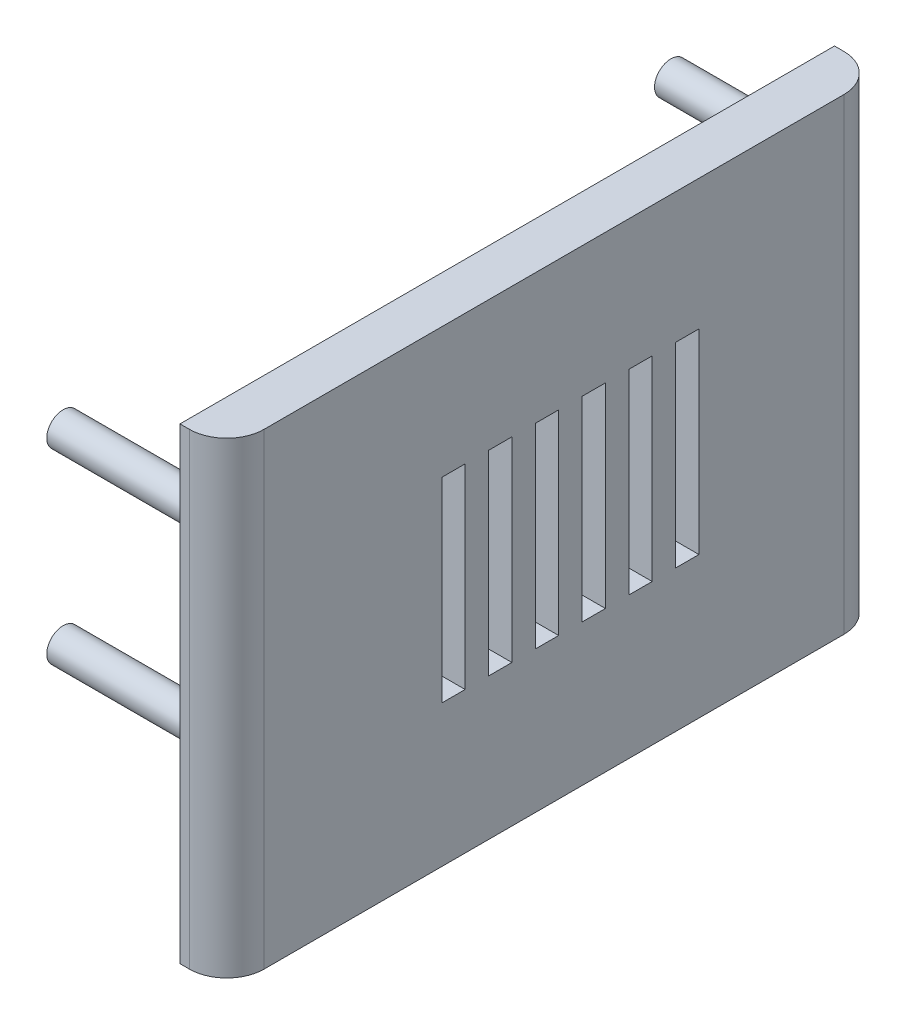
ISO-10303-21;
HEADER;
FILE_DESCRIPTION(('STEP AP214'),'2;1');
FILE_NAME('part.step','',(''),(''),'','','');
FILE_SCHEMA(('AUTOMOTIVE_DESIGN { 1 0 10303 214 1 1 1 1 }'));
ENDSEC;
DATA;
#1=APPLICATION_CONTEXT('core data for automotive mechanical design processes');
#2=APPLICATION_PROTOCOL_DEFINITION('international standard','automotive_design',2000,#1);
#3=PRODUCT_CONTEXT('',#1,'mechanical');
#4=PRODUCT('Part','Part','',(#3));
#5=PRODUCT_RELATED_PRODUCT_CATEGORY('part','',(#4));
#6=PRODUCT_DEFINITION_FORMATION('','',#4);
#7=PRODUCT_DEFINITION_CONTEXT('part definition',#1,'design');
#8=PRODUCT_DEFINITION('design','',#6,#7);
#9=PRODUCT_DEFINITION_SHAPE('','',#8);
#10=(LENGTH_UNIT() NAMED_UNIT(*) SI_UNIT(.MILLI.,.METRE.));
#11=(NAMED_UNIT(*) PLANE_ANGLE_UNIT() SI_UNIT($,.RADIAN.));
#12=(NAMED_UNIT(*) SI_UNIT($,.STERADIAN.) SOLID_ANGLE_UNIT());
#13=UNCERTAINTY_MEASURE_WITH_UNIT(LENGTH_MEASURE(1.E-05),#10,'distance_accuracy_value','');
#14=(GEOMETRIC_REPRESENTATION_CONTEXT(3) GLOBAL_UNCERTAINTY_ASSIGNED_CONTEXT((#13)) GLOBAL_UNIT_ASSIGNED_CONTEXT((#10,
#11,#12)) REPRESENTATION_CONTEXT('',''));
#15=CARTESIAN_POINT('',(0.,0.,0.));
#16=DIRECTION('',(0.,0.,1.));
#17=DIRECTION('',(1.,0.,0.));
#18=AXIS2_PLACEMENT_3D('',#15,#16,#17);
#19=CARTESIAN_POINT('',(10.,-50.,70.));
#20=DIRECTION('',(0.,0.,-1.));
#21=DIRECTION('',(-1.,0.,0.));
#22=AXIS2_PLACEMENT_3D('',#19,#20,#21);
#23=PLANE('',#22);
#24=DIRECTION('',(-1.,0.,0.));
#25=VECTOR('',#24,1.);
#26=CARTESIAN_POINT('',(10.,-50.,70.));
#27=LINE('',#26,#25);
#28=CARTESIAN_POINT('',(2.,-50.,70.));
#29=VERTEX_POINT('',#28);
#30=CARTESIAN_POINT('',(0.,-50.,70.));
#31=VERTEX_POINT('',#30);
#32=EDGE_CURVE('E397',#29,#31,#27,.T.);
#33=ORIENTED_EDGE('',*,*,#32,.F.);
#34=DIRECTION('',(0.,-1.,0.));
#35=VECTOR('',#34,1.);
#36=CARTESIAN_POINT('',(2.,50.,70.));
#37=LINE('',#36,#35);
#38=CARTESIAN_POINT('',(2.,50.,70.));
#39=VERTEX_POINT('',#38);
#40=EDGE_CURVE('E427',#29,#39,#37,.F.);
#41=ORIENTED_EDGE('',*,*,#40,.T.);
#42=DIRECTION('',(-1.,0.,0.));
#43=VECTOR('',#42,1.);
#44=CARTESIAN_POINT('',(10.,50.,70.));
#45=LINE('',#44,#43);
#46=CARTESIAN_POINT('',(0.,50.,70.));
#47=VERTEX_POINT('',#46);
#48=EDGE_CURVE('E381',#39,#47,#45,.T.);
#49=ORIENTED_EDGE('',*,*,#48,.T.);
#50=DIRECTION('',(0.,-1.,0.));
#51=VECTOR('',#50,1.);
#52=CARTESIAN_POINT('',(0.,-50.,70.));
#53=LINE('',#52,#51);
#54=EDGE_CURVE('E373',#47,#31,#53,.T.);
#55=ORIENTED_EDGE('',*,*,#54,.T.);
#56=EDGE_LOOP('',(#33,#41,#49,#55));
#57=FACE_BOUND('',#56,.T.);
#58=ADVANCED_FACE('F33',(#57),#23,.F.);
#59=CARTESIAN_POINT('',(10.,-50.,-70.));
#60=DIRECTION('',(0.,1.,0.));
#61=DIRECTION('',(0.,0.,1.));
#62=AXIS2_PLACEMENT_3D('',#59,#60,#61);
#63=PLANE('',#62);
#64=DIRECTION('',(-1.,0.,0.));
#65=VECTOR('',#64,1.);
#66=CARTESIAN_POINT('',(10.,-50.,-70.));
#67=LINE('',#66,#65);
#68=CARTESIAN_POINT('',(2.,-50.,-70.));
#69=VERTEX_POINT('',#68);
#70=CARTESIAN_POINT('',(0.,-50.,-70.));
#71=VERTEX_POINT('',#70);
#72=EDGE_CURVE('E395',#69,#71,#67,.T.);
#73=ORIENTED_EDGE('',*,*,#72,.F.);
#74=CARTESIAN_POINT('',(2.,-50.,-62.));
#75=DIRECTION('',(0.,1.,0.));
#76=DIRECTION('',(0.,0.,1.));
#77=AXIS2_PLACEMENT_3D('',#74,#75,#76);
#78=CIRCLE('',#77,8.);
#79=CARTESIAN_POINT('',(10.,-50.,-62.));
#80=VERTEX_POINT('',#79);
#81=EDGE_CURVE('E425',#69,#80,#78,.F.);
#82=ORIENTED_EDGE('',*,*,#81,.T.);
#83=DIRECTION('',(0.,0.,-1.));
#84=VECTOR('',#83,1.);
#85=CARTESIAN_POINT('',(10.,-50.,-70.));
#86=LINE('',#85,#84);
#87=CARTESIAN_POINT('',(10.,-50.,62.));
#88=VERTEX_POINT('',#87);
#89=EDGE_CURVE('E374',#88,#80,#86,.T.);
#90=ORIENTED_EDGE('',*,*,#89,.F.);
#91=CARTESIAN_POINT('',(2.,-50.,62.));
#92=DIRECTION('',(0.,1.,0.));
#93=DIRECTION('',(0.,0.,1.));
#94=AXIS2_PLACEMENT_3D('',#91,#92,#93);
#95=CIRCLE('',#94,8.);
#96=EDGE_CURVE('E423',#88,#29,#95,.F.);
#97=ORIENTED_EDGE('',*,*,#96,.T.);
#98=ORIENTED_EDGE('',*,*,#32,.T.);
#99=DIRECTION('',(0.,0.,-1.));
#100=VECTOR('',#99,1.);
#101=CARTESIAN_POINT('',(0.,-50.,-70.));
#102=LINE('',#101,#100);
#103=EDGE_CURVE('E384',#31,#71,#102,.T.);
#104=ORIENTED_EDGE('',*,*,#103,.T.);
#105=EDGE_LOOP('',(#73,#82,#90,#97,#98,#104));
#106=FACE_BOUND('',#105,.T.);
#107=ADVANCED_FACE('F513',(#106),#63,.F.);
#108=CARTESIAN_POINT('',(10.,-50.,-70.));
#109=DIRECTION('',(0.,0.,1.));
#110=DIRECTION('',(1.,0.,0.));
#111=AXIS2_PLACEMENT_3D('',#108,#109,#110);
#112=PLANE('',#111);
#113=DIRECTION('',(-1.,0.,0.));
#114=VECTOR('',#113,1.);
#115=CARTESIAN_POINT('',(10.,50.,-70.));
#116=LINE('',#115,#114);
#117=CARTESIAN_POINT('',(2.,50.,-70.));
#118=VERTEX_POINT('',#117);
#119=CARTESIAN_POINT('',(0.,50.,-70.));
#120=VERTEX_POINT('',#119);
#121=EDGE_CURVE('E393',#118,#120,#116,.T.);
#122=ORIENTED_EDGE('',*,*,#121,.F.);
#123=DIRECTION('',(0.,1.,0.));
#124=VECTOR('',#123,1.);
#125=CARTESIAN_POINT('',(2.,-50.,-70.));
#126=LINE('',#125,#124);
#127=EDGE_CURVE('E421',#118,#69,#126,.F.);
#128=ORIENTED_EDGE('',*,*,#127,.T.);
#129=ORIENTED_EDGE('',*,*,#72,.T.);
#130=DIRECTION('',(0.,1.,0.));
#131=VECTOR('',#130,1.);
#132=CARTESIAN_POINT('',(0.,-50.,-70.));
#133=LINE('',#132,#131);
#134=EDGE_CURVE('E387',#71,#120,#133,.T.);
#135=ORIENTED_EDGE('',*,*,#134,.T.);
#136=EDGE_LOOP('',(#122,#128,#129,#135));
#137=FACE_BOUND('',#136,.T.);
#138=ADVANCED_FACE('F519',(#137),#112,.F.);
#139=CARTESIAN_POINT('',(10.,50.,-70.));
#140=DIRECTION('',(0.,-1.,0.));
#141=DIRECTION('',(0.,0.,-1.));
#142=AXIS2_PLACEMENT_3D('',#139,#140,#141);
#143=PLANE('',#142);
#144=DIRECTION('',(0.,0.,1.));
#145=VECTOR('',#144,1.);
#146=CARTESIAN_POINT('',(10.,50.,-70.));
#147=LINE('',#146,#145);
#148=CARTESIAN_POINT('',(10.,50.,-62.));
#149=VERTEX_POINT('',#148);
#150=CARTESIAN_POINT('',(10.,50.,62.));
#151=VERTEX_POINT('',#150);
#152=EDGE_CURVE('E377',#149,#151,#147,.T.);
#153=ORIENTED_EDGE('',*,*,#152,.F.);
#154=CARTESIAN_POINT('',(2.,50.,-62.));
#155=DIRECTION('',(0.,-1.,0.));
#156=DIRECTION('',(0.,0.,-1.));
#157=AXIS2_PLACEMENT_3D('',#154,#155,#156);
#158=CIRCLE('',#157,8.);
#159=EDGE_CURVE('E419',#149,#118,#158,.F.);
#160=ORIENTED_EDGE('',*,*,#159,.T.);
#161=ORIENTED_EDGE('',*,*,#121,.T.);
#162=DIRECTION('',(0.,0.,1.));
#163=VECTOR('',#162,1.);
#164=CARTESIAN_POINT('',(0.,50.,-70.));
#165=LINE('',#164,#163);
#166=EDGE_CURVE('E378',#120,#47,#165,.T.);
#167=ORIENTED_EDGE('',*,*,#166,.T.);
#168=ORIENTED_EDGE('',*,*,#48,.F.);
#169=CARTESIAN_POINT('',(2.,50.,62.));
#170=DIRECTION('',(0.,-1.,0.));
#171=DIRECTION('',(0.,0.,-1.));
#172=AXIS2_PLACEMENT_3D('',#169,#170,#171);
#173=CIRCLE('',#172,8.);
#174=EDGE_CURVE('E417',#39,#151,#173,.F.);
#175=ORIENTED_EDGE('',*,*,#174,.T.);
#176=EDGE_LOOP('',(#153,#160,#161,#167,#168,#175));
#177=FACE_BOUND('',#176,.T.);
#178=ADVANCED_FACE('F556',(#177),#143,.F.);
#179=CARTESIAN_POINT('',(10.,0.,0.));
#180=DIRECTION('',(1.,0.,0.));
#181=DIRECTION('',(0.,0.,-1.));
#182=AXIS2_PLACEMENT_3D('',#179,#180,#181);
#183=PLANE('',#182);
#184=DIRECTION('',(0.,-1.,0.));
#185=VECTOR('',#184,1.);
#186=CARTESIAN_POINT('',(10.,22.1,-26.));
#187=LINE('',#186,#185);
#188=CARTESIAN_POINT('',(10.,22.1,-26.));
#189=VERTEX_POINT('',#188);
#190=CARTESIAN_POINT('',(10.,-19.7,-26.));
#191=VERTEX_POINT('',#190);
#192=EDGE_CURVE('E48',#189,#191,#187,.T.);
#193=ORIENTED_EDGE('',*,*,#192,.F.);
#194=DIRECTION('',(0.,0.,1.));
#195=VECTOR('',#194,1.);
#196=CARTESIAN_POINT('',(10.,22.1,-26.));
#197=LINE('',#196,#195);
#198=CARTESIAN_POINT('',(10.,22.1,-31.));
#199=VERTEX_POINT('',#198);
#200=EDGE_CURVE('E254',#199,#189,#197,.T.);
#201=ORIENTED_EDGE('',*,*,#200,.F.);
#202=DIRECTION('',(0.,1.,0.));
#203=VECTOR('',#202,1.);
#204=CARTESIAN_POINT('',(10.,22.1,-31.));
#205=LINE('',#204,#203);
#206=CARTESIAN_POINT('',(10.,-19.7,-31.));
#207=VERTEX_POINT('',#206);
#208=EDGE_CURVE('E237',#207,#199,#205,.T.);
#209=ORIENTED_EDGE('',*,*,#208,.F.);
#210=DIRECTION('',(0.,0.,-1.));
#211=VECTOR('',#210,1.);
#212=CARTESIAN_POINT('',(10.,-19.7,-26.));
#213=LINE('',#212,#211);
#214=EDGE_CURVE('E247',#191,#207,#213,.T.);
#215=ORIENTED_EDGE('',*,*,#214,.F.);
#216=EDGE_LOOP('',(#193,#201,#209,#215));
#217=FACE_BOUND('',#216,.T.);
#218=DIRECTION('',(0.,-1.,0.));
#219=VECTOR('',#218,1.);
#220=CARTESIAN_POINT('',(10.,22.1,14.));
#221=LINE('',#220,#219);
#222=CARTESIAN_POINT('',(10.,22.1,14.));
#223=VERTEX_POINT('',#222);
#224=CARTESIAN_POINT('',(10.,-19.7,14.));
#225=VERTEX_POINT('',#224);
#226=EDGE_CURVE('E56',#223,#225,#221,.T.);
#227=ORIENTED_EDGE('',*,*,#226,.F.);
#228=DIRECTION('',(0.,0.,1.));
#229=VECTOR('',#228,1.);
#230=CARTESIAN_POINT('',(10.,22.1,14.));
#231=LINE('',#230,#229);
#232=CARTESIAN_POINT('',(10.,22.1,9.));
#233=VERTEX_POINT('',#232);
#234=EDGE_CURVE('E271',#233,#223,#231,.T.);
#235=ORIENTED_EDGE('',*,*,#234,.F.);
#236=DIRECTION('',(0.,1.,0.));
#237=VECTOR('',#236,1.);
#238=CARTESIAN_POINT('',(10.,22.1,9.));
#239=LINE('',#238,#237);
#240=CARTESIAN_POINT('',(10.,-19.7,8.99999999999999));
#241=VERTEX_POINT('',#240);
#242=EDGE_CURVE('E268',#241,#233,#239,.T.);
#243=ORIENTED_EDGE('',*,*,#242,.F.);
#244=DIRECTION('',(0.,0.,-1.));
#245=VECTOR('',#244,1.);
#246=CARTESIAN_POINT('',(10.,-19.7,14.));
#247=LINE('',#246,#245);
#248=EDGE_CURVE('E265',#225,#241,#247,.T.);
#249=ORIENTED_EDGE('',*,*,#248,.F.);
#250=EDGE_LOOP('',(#227,#235,#243,#249));
#251=FACE_BOUND('',#250,.T.);
#252=DIRECTION('',(0.,-1.,0.));
#253=VECTOR('',#252,1.);
#254=CARTESIAN_POINT('',(10.,22.1,-16.));
#255=LINE('',#254,#253);
#256=CARTESIAN_POINT('',(10.,22.1,-16.));
#257=VERTEX_POINT('',#256);
#258=CARTESIAN_POINT('',(10.,-19.7,-16.));
#259=VERTEX_POINT('',#258);
#260=EDGE_CURVE('E323',#257,#259,#255,.T.);
#261=ORIENTED_EDGE('',*,*,#260,.F.);
#262=DIRECTION('',(0.,0.,1.));
#263=VECTOR('',#262,1.);
#264=CARTESIAN_POINT('',(10.,22.1,-16.));
#265=LINE('',#264,#263);
#266=CARTESIAN_POINT('',(10.,22.1,-21.));
#267=VERTEX_POINT('',#266);
#268=EDGE_CURVE('E332',#267,#257,#265,.T.);
#269=ORIENTED_EDGE('',*,*,#268,.F.);
#270=DIRECTION('',(0.,1.,0.));
#271=VECTOR('',#270,1.);
#272=CARTESIAN_POINT('',(10.,22.1,-21.));
#273=LINE('',#272,#271);
#274=CARTESIAN_POINT('',(10.,-19.7,-21.));
#275=VERTEX_POINT('',#274);
#276=EDGE_CURVE('E329',#275,#267,#273,.T.);
#277=ORIENTED_EDGE('',*,*,#276,.F.);
#278=DIRECTION('',(0.,0.,-1.));
#279=VECTOR('',#278,1.);
#280=CARTESIAN_POINT('',(10.,-19.7,-16.));
#281=LINE('',#280,#279);
#282=EDGE_CURVE('E325',#259,#275,#281,.T.);
#283=ORIENTED_EDGE('',*,*,#282,.F.);
#284=EDGE_LOOP('',(#261,#269,#277,#283));
#285=FACE_BOUND('',#284,.T.);
#286=DIRECTION('',(0.,-1.,0.));
#287=VECTOR('',#286,1.);
#288=CARTESIAN_POINT('',(10.,22.1,4.));
#289=LINE('',#288,#287);
#290=CARTESIAN_POINT('',(10.,22.1,4.));
#291=VERTEX_POINT('',#290);
#292=CARTESIAN_POINT('',(10.,-19.7,3.99999999999999));
#293=VERTEX_POINT('',#292);
#294=EDGE_CURVE('E298',#291,#293,#289,.T.);
#295=ORIENTED_EDGE('',*,*,#294,.F.);
#296=DIRECTION('',(0.,0.,1.));
#297=VECTOR('',#296,1.);
#298=CARTESIAN_POINT('',(10.,22.1,4.));
#299=LINE('',#298,#297);
#300=CARTESIAN_POINT('',(10.,22.1,-1.00000000000001));
#301=VERTEX_POINT('',#300);
#302=EDGE_CURVE('E351',#301,#291,#299,.T.);
#303=ORIENTED_EDGE('',*,*,#302,.F.);
#304=DIRECTION('',(0.,1.,0.));
#305=VECTOR('',#304,1.);
#306=CARTESIAN_POINT('',(10.,22.1,-1.00000000000001));
#307=LINE('',#306,#305);
#308=CARTESIAN_POINT('',(10.,-19.7,-1.00000000000001));
#309=VERTEX_POINT('',#308);
#310=EDGE_CURVE('E348',#309,#301,#307,.T.);
#311=ORIENTED_EDGE('',*,*,#310,.F.);
#312=DIRECTION('',(0.,0.,-1.));
#313=VECTOR('',#312,1.);
#314=CARTESIAN_POINT('',(10.,-19.7,3.99999999999999));
#315=LINE('',#314,#313);
#316=EDGE_CURVE('E345',#293,#309,#315,.T.);
#317=ORIENTED_EDGE('',*,*,#316,.F.);
#318=EDGE_LOOP('',(#295,#303,#311,#317));
#319=FACE_BOUND('',#318,.T.);
#320=DIRECTION('',(0.,-1.,0.));
#321=VECTOR('',#320,1.);
#322=CARTESIAN_POINT('',(10.,22.1,-6.00000000000001));
#323=LINE('',#322,#321);
#324=CARTESIAN_POINT('',(10.,22.1,-6.00000000000001));
#325=VERTEX_POINT('',#324);
#326=CARTESIAN_POINT('',(10.,-19.7,-6.00000000000001));
#327=VERTEX_POINT('',#326);
#328=EDGE_CURVE('E283',#325,#327,#323,.T.);
#329=ORIENTED_EDGE('',*,*,#328,.F.);
#330=DIRECTION('',(0.,0.,1.));
#331=VECTOR('',#330,1.);
#332=CARTESIAN_POINT('',(10.,22.1,-6.00000000000001));
#333=LINE('',#332,#331);
#334=CARTESIAN_POINT('',(10.,22.1,-11.));
#335=VERTEX_POINT('',#334);
#336=EDGE_CURVE('E292',#335,#325,#333,.T.);
#337=ORIENTED_EDGE('',*,*,#336,.F.);
#338=DIRECTION('',(0.,1.,0.));
#339=VECTOR('',#338,1.);
#340=CARTESIAN_POINT('',(10.,22.1,-11.));
#341=LINE('',#340,#339);
#342=CARTESIAN_POINT('',(10.,-19.7,-11.));
#343=VERTEX_POINT('',#342);
#344=EDGE_CURVE('E289',#343,#335,#341,.T.);
#345=ORIENTED_EDGE('',*,*,#344,.F.);
#346=DIRECTION('',(0.,0.,-1.));
#347=VECTOR('',#346,1.);
#348=CARTESIAN_POINT('',(10.,-19.7,-6.00000000000001));
#349=LINE('',#348,#347);
#350=EDGE_CURVE('E285',#327,#343,#349,.T.);
#351=ORIENTED_EDGE('',*,*,#350,.F.);
#352=EDGE_LOOP('',(#329,#337,#345,#351));
#353=FACE_BOUND('',#352,.T.);
#354=DIRECTION('',(0.,-1.,0.));
#355=VECTOR('',#354,1.);
#356=CARTESIAN_POINT('',(10.,22.1,24.));
#357=LINE('',#356,#355);
#358=CARTESIAN_POINT('',(10.,22.1,24.));
#359=VERTEX_POINT('',#358);
#360=CARTESIAN_POINT('',(10.,-19.7,24.));
#361=VERTEX_POINT('',#360);
#362=EDGE_CURVE('E277',#359,#361,#357,.T.);
#363=ORIENTED_EDGE('',*,*,#362,.F.);
#364=DIRECTION('',(0.,0.,1.));
#365=VECTOR('',#364,1.);
#366=CARTESIAN_POINT('',(10.,22.1,24.));
#367=LINE('',#366,#365);
#368=CARTESIAN_POINT('',(10.,22.1,19.));
#369=VERTEX_POINT('',#368);
#370=EDGE_CURVE('E312',#369,#359,#367,.T.);
#371=ORIENTED_EDGE('',*,*,#370,.F.);
#372=DIRECTION('',(0.,1.,0.));
#373=VECTOR('',#372,1.);
#374=CARTESIAN_POINT('',(10.,22.1,19.));
#375=LINE('',#374,#373);
#376=CARTESIAN_POINT('',(10.,-19.7,19.));
#377=VERTEX_POINT('',#376);
#378=EDGE_CURVE('E309',#377,#369,#375,.T.);
#379=ORIENTED_EDGE('',*,*,#378,.F.);
#380=DIRECTION('',(0.,0.,-1.));
#381=VECTOR('',#380,1.);
#382=CARTESIAN_POINT('',(10.,-19.7,24.));
#383=LINE('',#382,#381);
#384=EDGE_CURVE('E306',#361,#377,#383,.T.);
#385=ORIENTED_EDGE('',*,*,#384,.F.);
#386=EDGE_LOOP('',(#363,#371,#379,#385));
#387=FACE_BOUND('',#386,.T.);
#388=ORIENTED_EDGE('',*,*,#89,.T.);
#389=DIRECTION('',(0.,1.,0.));
#390=VECTOR('',#389,1.);
#391=CARTESIAN_POINT('',(10.,50.,-62.));
#392=LINE('',#391,#390);
#393=EDGE_CURVE('E414',#80,#149,#392,.T.);
#394=ORIENTED_EDGE('',*,*,#393,.T.);
#395=ORIENTED_EDGE('',*,*,#152,.T.);
#396=DIRECTION('',(0.,-1.,0.));
#397=VECTOR('',#396,1.);
#398=CARTESIAN_POINT('',(10.,-50.,62.));
#399=LINE('',#398,#397);
#400=EDGE_CURVE('E411',#151,#88,#399,.T.);
#401=ORIENTED_EDGE('',*,*,#400,.T.);
#402=EDGE_LOOP('',(#388,#394,#395,#401));
#403=FACE_BOUND('',#402,.T.);
#404=ADVANCED_FACE('F251',(#217,#251,#285,#319,#353,#387,#403),#183,.T.);
#405=CARTESIAN_POINT('',(0.,0.,0.));
#406=DIRECTION('',(1.,0.,0.));
#407=DIRECTION('',(0.,0.,-1.));
#408=AXIS2_PLACEMENT_3D('',#405,#406,#407);
#409=PLANE('',#408);
#410=DIRECTION('',(0.,0.,1.));
#411=VECTOR('',#410,1.);
#412=CARTESIAN_POINT('',(0.,22.1,0.));
#413=LINE('',#412,#411);
#414=CARTESIAN_POINT('',(0.,22.1,-31.));
#415=VERTEX_POINT('',#414);
#416=CARTESIAN_POINT('',(0.,22.1,-26.));
#417=VERTEX_POINT('',#416);
#418=EDGE_CURVE('E41',#415,#417,#413,.T.);
#419=ORIENTED_EDGE('',*,*,#418,.T.);
#420=DIRECTION('',(0.,-1.,0.));
#421=VECTOR('',#420,1.);
#422=CARTESIAN_POINT('',(0.,0.,-26.));
#423=LINE('',#422,#421);
#424=CARTESIAN_POINT('',(0.,-19.7,-26.));
#425=VERTEX_POINT('',#424);
#426=EDGE_CURVE('E11',#417,#425,#423,.T.);
#427=ORIENTED_EDGE('',*,*,#426,.T.);
#428=DIRECTION('',(0.,0.,-1.));
#429=VECTOR('',#428,1.);
#430=CARTESIAN_POINT('',(0.,-19.7,0.));
#431=LINE('',#430,#429);
#432=CARTESIAN_POINT('',(0.,-19.7,-31.));
#433=VERTEX_POINT('',#432);
#434=EDGE_CURVE('E489',#425,#433,#431,.T.);
#435=ORIENTED_EDGE('',*,*,#434,.T.);
#436=DIRECTION('',(0.,1.,0.));
#437=VECTOR('',#436,1.);
#438=CARTESIAN_POINT('',(0.,0.,-31.));
#439=LINE('',#438,#437);
#440=EDGE_CURVE('E240',#433,#415,#439,.T.);
#441=ORIENTED_EDGE('',*,*,#440,.T.);
#442=EDGE_LOOP('',(#419,#427,#435,#441));
#443=FACE_BOUND('',#442,.T.);
#444=DIRECTION('',(0.,0.,1.));
#445=VECTOR('',#444,1.);
#446=CARTESIAN_POINT('',(0.,22.1,0.));
#447=LINE('',#446,#445);
#448=CARTESIAN_POINT('',(0.,22.1,9.));
#449=VERTEX_POINT('',#448);
#450=CARTESIAN_POINT('',(0.,22.1,14.));
#451=VERTEX_POINT('',#450);
#452=EDGE_CURVE('E483',#449,#451,#447,.T.);
#453=ORIENTED_EDGE('',*,*,#452,.T.);
#454=DIRECTION('',(0.,-1.,0.));
#455=VECTOR('',#454,1.);
#456=CARTESIAN_POINT('',(0.,0.,14.));
#457=LINE('',#456,#455);
#458=CARTESIAN_POINT('',(0.,-19.7,14.));
#459=VERTEX_POINT('',#458);
#460=EDGE_CURVE('E486',#451,#459,#457,.T.);
#461=ORIENTED_EDGE('',*,*,#460,.T.);
#462=DIRECTION('',(0.,0.,-1.));
#463=VECTOR('',#462,1.);
#464=CARTESIAN_POINT('',(0.,-19.7,0.));
#465=LINE('',#464,#463);
#466=CARTESIAN_POINT('',(0.,-19.7,8.99999999999999));
#467=VERTEX_POINT('',#466);
#468=EDGE_CURVE('E477',#459,#467,#465,.T.);
#469=ORIENTED_EDGE('',*,*,#468,.T.);
#470=DIRECTION('',(0.,1.,0.));
#471=VECTOR('',#470,1.);
#472=CARTESIAN_POINT('',(0.,0.,8.99999999999999));
#473=LINE('',#472,#471);
#474=EDGE_CURVE('E480',#467,#449,#473,.T.);
#475=ORIENTED_EDGE('',*,*,#474,.T.);
#476=EDGE_LOOP('',(#453,#461,#469,#475));
#477=FACE_BOUND('',#476,.T.);
#478=DIRECTION('',(0.,0.,1.));
#479=VECTOR('',#478,1.);
#480=CARTESIAN_POINT('',(0.,22.1,0.));
#481=LINE('',#480,#479);
#482=CARTESIAN_POINT('',(0.,22.1,-21.));
#483=VERTEX_POINT('',#482);
#484=CARTESIAN_POINT('',(0.,22.1,-16.));
#485=VERTEX_POINT('',#484);
#486=EDGE_CURVE('E471',#483,#485,#481,.T.);
#487=ORIENTED_EDGE('',*,*,#486,.T.);
#488=DIRECTION('',(0.,-1.,0.));
#489=VECTOR('',#488,1.);
#490=CARTESIAN_POINT('',(0.,0.,-16.));
#491=LINE('',#490,#489);
#492=CARTESIAN_POINT('',(0.,-19.7,-16.));
#493=VERTEX_POINT('',#492);
#494=EDGE_CURVE('E474',#485,#493,#491,.T.);
#495=ORIENTED_EDGE('',*,*,#494,.T.);
#496=DIRECTION('',(0.,0.,-1.));
#497=VECTOR('',#496,1.);
#498=CARTESIAN_POINT('',(0.,-19.7,0.));
#499=LINE('',#498,#497);
#500=CARTESIAN_POINT('',(0.,-19.7,-21.));
#501=VERTEX_POINT('',#500);
#502=EDGE_CURVE('E465',#493,#501,#499,.T.);
#503=ORIENTED_EDGE('',*,*,#502,.T.);
#504=DIRECTION('',(0.,1.,0.));
#505=VECTOR('',#504,1.);
#506=CARTESIAN_POINT('',(0.,0.,-21.));
#507=LINE('',#506,#505);
#508=EDGE_CURVE('E468',#501,#483,#507,.T.);
#509=ORIENTED_EDGE('',*,*,#508,.T.);
#510=EDGE_LOOP('',(#487,#495,#503,#509));
#511=FACE_BOUND('',#510,.T.);
#512=DIRECTION('',(0.,0.,1.));
#513=VECTOR('',#512,1.);
#514=CARTESIAN_POINT('',(0.,22.1,0.));
#515=LINE('',#514,#513);
#516=CARTESIAN_POINT('',(0.,22.1,-1.00000000000001));
#517=VERTEX_POINT('',#516);
#518=CARTESIAN_POINT('',(0.,22.1,4.));
#519=VERTEX_POINT('',#518);
#520=EDGE_CURVE('E459',#517,#519,#515,.T.);
#521=ORIENTED_EDGE('',*,*,#520,.T.);
#522=DIRECTION('',(0.,-1.,0.));
#523=VECTOR('',#522,1.);
#524=CARTESIAN_POINT('',(0.,0.,3.99999999999999));
#525=LINE('',#524,#523);
#526=CARTESIAN_POINT('',(0.,-19.7,3.99999999999999));
#527=VERTEX_POINT('',#526);
#528=EDGE_CURVE('E462',#519,#527,#525,.T.);
#529=ORIENTED_EDGE('',*,*,#528,.T.);
#530=DIRECTION('',(0.,0.,-1.));
#531=VECTOR('',#530,1.);
#532=CARTESIAN_POINT('',(0.,-19.7,0.));
#533=LINE('',#532,#531);
#534=CARTESIAN_POINT('',(0.,-19.7,-1.00000000000001));
#535=VERTEX_POINT('',#534);
#536=EDGE_CURVE('E453',#527,#535,#533,.T.);
#537=ORIENTED_EDGE('',*,*,#536,.T.);
#538=DIRECTION('',(0.,1.,0.));
#539=VECTOR('',#538,1.);
#540=CARTESIAN_POINT('',(0.,0.,-1.00000000000001));
#541=LINE('',#540,#539);
#542=EDGE_CURVE('E456',#535,#517,#541,.T.);
#543=ORIENTED_EDGE('',*,*,#542,.T.);
#544=EDGE_LOOP('',(#521,#529,#537,#543));
#545=FACE_BOUND('',#544,.T.);
#546=DIRECTION('',(0.,0.,1.));
#547=VECTOR('',#546,1.);
#548=CARTESIAN_POINT('',(0.,22.1,0.));
#549=LINE('',#548,#547);
#550=CARTESIAN_POINT('',(0.,22.1,-11.));
#551=VERTEX_POINT('',#550);
#552=CARTESIAN_POINT('',(0.,22.1,-6.00000000000001));
#553=VERTEX_POINT('',#552);
#554=EDGE_CURVE('E447',#551,#553,#549,.T.);
#555=ORIENTED_EDGE('',*,*,#554,.T.);
#556=DIRECTION('',(0.,-1.,0.));
#557=VECTOR('',#556,1.);
#558=CARTESIAN_POINT('',(0.,0.,-6.00000000000001));
#559=LINE('',#558,#557);
#560=CARTESIAN_POINT('',(0.,-19.7,-6.00000000000001));
#561=VERTEX_POINT('',#560);
#562=EDGE_CURVE('E450',#553,#561,#559,.T.);
#563=ORIENTED_EDGE('',*,*,#562,.T.);
#564=DIRECTION('',(0.,0.,-1.));
#565=VECTOR('',#564,1.);
#566=CARTESIAN_POINT('',(0.,-19.7,0.));
#567=LINE('',#566,#565);
#568=CARTESIAN_POINT('',(0.,-19.7,-11.));
#569=VERTEX_POINT('',#568);
#570=EDGE_CURVE('E441',#561,#569,#567,.T.);
#571=ORIENTED_EDGE('',*,*,#570,.T.);
#572=DIRECTION('',(0.,1.,0.));
#573=VECTOR('',#572,1.);
#574=CARTESIAN_POINT('',(0.,0.,-11.));
#575=LINE('',#574,#573);
#576=EDGE_CURVE('E444',#569,#551,#575,.T.);
#577=ORIENTED_EDGE('',*,*,#576,.T.);
#578=EDGE_LOOP('',(#555,#563,#571,#577));
#579=FACE_BOUND('',#578,.T.);
#580=DIRECTION('',(0.,0.,1.));
#581=VECTOR('',#580,1.);
#582=CARTESIAN_POINT('',(0.,22.1,0.));
#583=LINE('',#582,#581);
#584=CARTESIAN_POINT('',(0.,22.1,19.));
#585=VERTEX_POINT('',#584);
#586=CARTESIAN_POINT('',(0.,22.1,24.));
#587=VERTEX_POINT('',#586);
#588=EDGE_CURVE('E435',#585,#587,#583,.T.);
#589=ORIENTED_EDGE('',*,*,#588,.T.);
#590=DIRECTION('',(0.,-1.,0.));
#591=VECTOR('',#590,1.);
#592=CARTESIAN_POINT('',(0.,0.,24.));
#593=LINE('',#592,#591);
#594=CARTESIAN_POINT('',(0.,-19.7,24.));
#595=VERTEX_POINT('',#594);
#596=EDGE_CURVE('E438',#587,#595,#593,.T.);
#597=ORIENTED_EDGE('',*,*,#596,.T.);
#598=DIRECTION('',(0.,0.,-1.));
#599=VECTOR('',#598,1.);
#600=CARTESIAN_POINT('',(0.,-19.7,0.));
#601=LINE('',#600,#599);
#602=CARTESIAN_POINT('',(0.,-19.7,19.));
#603=VERTEX_POINT('',#602);
#604=EDGE_CURVE('E429',#595,#603,#601,.T.);
#605=ORIENTED_EDGE('',*,*,#604,.T.);
#606=DIRECTION('',(0.,1.,0.));
#607=VECTOR('',#606,1.);
#608=CARTESIAN_POINT('',(0.,0.,19.));
#609=LINE('',#608,#607);
#610=EDGE_CURVE('E432',#603,#585,#609,.T.);
#611=ORIENTED_EDGE('',*,*,#610,.T.);
#612=EDGE_LOOP('',(#589,#597,#605,#611));
#613=FACE_BOUND('',#612,.T.);
#614=CARTESIAN_POINT('',(0.,-8.37326780000001,65.));
#615=DIRECTION('',(1.,0.,0.));
#616=DIRECTION('',(0.,0.,-1.));
#617=AXIS2_PLACEMENT_3D('',#614,#615,#616);
#618=CIRCLE('',#617,3.50000000000001);
#619=CARTESIAN_POINT('',(0.,-8.37326780000001,61.5));
#620=VERTEX_POINT('',#619);
#621=EDGE_CURVE('E408',#620,#620,#618,.F.);
#622=ORIENTED_EDGE('',*,*,#621,.F.);
#623=EDGE_LOOP('',(#622));
#624=FACE_BOUND('',#623,.T.);
#625=CARTESIAN_POINT('',(0.,31.6267322,65.));
#626=DIRECTION('',(1.,0.,0.));
#627=DIRECTION('',(0.,0.,-1.));
#628=AXIS2_PLACEMENT_3D('',#625,#626,#627);
#629=CIRCLE('',#628,3.50000000000001);
#630=CARTESIAN_POINT('',(0.,31.6267322,61.5));
#631=VERTEX_POINT('',#630);
#632=EDGE_CURVE('E405',#631,#631,#629,.F.);
#633=ORIENTED_EDGE('',*,*,#632,.F.);
#634=EDGE_LOOP('',(#633));
#635=FACE_BOUND('',#634,.T.);
#636=CARTESIAN_POINT('',(0.,-8.37326780000001,-65.));
#637=DIRECTION('',(1.,0.,0.));
#638=DIRECTION('',(0.,0.,-1.));
#639=AXIS2_PLACEMENT_3D('',#636,#637,#638);
#640=CIRCLE('',#639,3.5);
#641=CARTESIAN_POINT('',(0.,-8.37326780000001,-68.5));
#642=VERTEX_POINT('',#641);
#643=EDGE_CURVE('E402',#642,#642,#640,.F.);
#644=ORIENTED_EDGE('',*,*,#643,.F.);
#645=EDGE_LOOP('',(#644));
#646=FACE_BOUND('',#645,.T.);
#647=CARTESIAN_POINT('',(0.,31.6267322,-65.));
#648=DIRECTION('',(1.,0.,0.));
#649=DIRECTION('',(0.,0.,-1.));
#650=AXIS2_PLACEMENT_3D('',#647,#648,#649);
#651=CIRCLE('',#650,3.5);
#652=CARTESIAN_POINT('',(0.,31.6267322,-68.5));
#653=VERTEX_POINT('',#652);
#654=EDGE_CURVE('E399',#653,#653,#651,.F.);
#655=ORIENTED_EDGE('',*,*,#654,.F.);
#656=EDGE_LOOP('',(#655));
#657=FACE_BOUND('',#656,.T.);
#658=ORIENTED_EDGE('',*,*,#54,.F.);
#659=ORIENTED_EDGE('',*,*,#166,.F.);
#660=ORIENTED_EDGE('',*,*,#134,.F.);
#661=ORIENTED_EDGE('',*,*,#103,.F.);
#662=EDGE_LOOP('',(#658,#659,#660,#661));
#663=FACE_BOUND('',#662,.T.);
#664=ADVANCED_FACE('F493',(#443,#477,#511,#545,#579,#613,#624,#635,#646,#657,#663),#409,.F.);
#665=CARTESIAN_POINT('',(-30.,31.6267322,-65.));
#666=DIRECTION('',(1.,0.,0.));
#667=DIRECTION('',(0.,0.,-1.));
#668=AXIS2_PLACEMENT_3D('',#665,#666,#667);
#669=CYLINDRICAL_SURFACE('',#668,3.5);
#670=CARTESIAN_POINT('',(-30.,31.6267322,-65.));
#671=DIRECTION('',(-1.,0.,0.));
#672=DIRECTION('',(0.,0.,1.));
#673=AXIS2_PLACEMENT_3D('',#670,#671,#672);
#674=CIRCLE('',#673,3.5);
#675=CARTESIAN_POINT('',(-30.,31.6267322,-61.5));
#676=VERTEX_POINT('',#675);
#677=EDGE_CURVE('E370',#676,#676,#674,.T.);
#678=ORIENTED_EDGE('',*,*,#677,.F.);
#679=EDGE_LOOP('',(#678));
#680=FACE_BOUND('',#679,.T.);
#681=ORIENTED_EDGE('',*,*,#654,.T.);
#682=EDGE_LOOP('',(#681));
#683=FACE_BOUND('',#682,.T.);
#684=ADVANCED_FACE('F566',(#680,#683),#669,.T.);
#685=CARTESIAN_POINT('',(-30.,31.6267322,-65.));
#686=DIRECTION('',(-1.,0.,0.));
#687=DIRECTION('',(0.,0.,1.));
#688=AXIS2_PLACEMENT_3D('',#685,#686,#687);
#689=PLANE('',#688);
#690=ORIENTED_EDGE('',*,*,#677,.T.);
#691=EDGE_LOOP('',(#690));
#692=FACE_BOUND('',#691,.T.);
#693=ADVANCED_FACE('F570',(#692),#689,.T.);
#694=CARTESIAN_POINT('',(-30.,-8.37326780000001,-65.));
#695=DIRECTION('',(1.,0.,0.));
#696=DIRECTION('',(0.,0.,-1.));
#697=AXIS2_PLACEMENT_3D('',#694,#695,#696);
#698=CYLINDRICAL_SURFACE('',#697,3.5);
#699=CARTESIAN_POINT('',(-30.,-8.37326780000001,-65.));
#700=DIRECTION('',(-1.,0.,0.));
#701=DIRECTION('',(0.,0.,1.));
#702=AXIS2_PLACEMENT_3D('',#699,#700,#701);
#703=CIRCLE('',#702,3.5);
#704=CARTESIAN_POINT('',(-30.,-8.37326780000001,-61.5));
#705=VERTEX_POINT('',#704);
#706=EDGE_CURVE('E367',#705,#705,#703,.T.);
#707=ORIENTED_EDGE('',*,*,#706,.F.);
#708=EDGE_LOOP('',(#707));
#709=FACE_BOUND('',#708,.T.);
#710=ORIENTED_EDGE('',*,*,#643,.T.);
#711=EDGE_LOOP('',(#710));
#712=FACE_BOUND('',#711,.T.);
#713=ADVANCED_FACE('F574',(#709,#712),#698,.T.);
#714=CARTESIAN_POINT('',(-30.,-8.37326780000001,-65.));
#715=DIRECTION('',(-1.,0.,0.));
#716=DIRECTION('',(0.,0.,1.));
#717=AXIS2_PLACEMENT_3D('',#714,#715,#716);
#718=PLANE('',#717);
#719=ORIENTED_EDGE('',*,*,#706,.T.);
#720=EDGE_LOOP('',(#719));
#721=FACE_BOUND('',#720,.T.);
#722=ADVANCED_FACE('F578',(#721),#718,.T.);
#723=CARTESIAN_POINT('',(-30.,31.6267322,65.));
#724=DIRECTION('',(1.,0.,0.));
#725=DIRECTION('',(0.,0.,-1.));
#726=AXIS2_PLACEMENT_3D('',#723,#724,#725);
#727=CYLINDRICAL_SURFACE('',#726,3.50000000000001);
#728=CARTESIAN_POINT('',(-30.,31.6267322,65.));
#729=DIRECTION('',(-1.,0.,0.));
#730=DIRECTION('',(0.,0.,1.));
#731=AXIS2_PLACEMENT_3D('',#728,#729,#730);
#732=CIRCLE('',#731,3.50000000000001);
#733=CARTESIAN_POINT('',(-30.,31.6267322,68.5));
#734=VERTEX_POINT('',#733);
#735=EDGE_CURVE('E364',#734,#734,#732,.T.);
#736=ORIENTED_EDGE('',*,*,#735,.F.);
#737=EDGE_LOOP('',(#736));
#738=FACE_BOUND('',#737,.T.);
#739=ORIENTED_EDGE('',*,*,#632,.T.);
#740=EDGE_LOOP('',(#739));
#741=FACE_BOUND('',#740,.T.);
#742=ADVANCED_FACE('F582',(#738,#741),#727,.T.);
#743=CARTESIAN_POINT('',(-30.,31.6267322,65.));
#744=DIRECTION('',(-1.,0.,0.));
#745=DIRECTION('',(0.,0.,1.));
#746=AXIS2_PLACEMENT_3D('',#743,#744,#745);
#747=PLANE('',#746);
#748=ORIENTED_EDGE('',*,*,#735,.T.);
#749=EDGE_LOOP('',(#748));
#750=FACE_BOUND('',#749,.T.);
#751=ADVANCED_FACE('F586',(#750),#747,.T.);
#752=CARTESIAN_POINT('',(-30.,-8.37326780000001,65.));
#753=DIRECTION('',(1.,0.,0.));
#754=DIRECTION('',(0.,0.,-1.));
#755=AXIS2_PLACEMENT_3D('',#752,#753,#754);
#756=CYLINDRICAL_SURFACE('',#755,3.50000000000001);
#757=CARTESIAN_POINT('',(-30.,-8.37326780000001,65.));
#758=DIRECTION('',(-1.,0.,0.));
#759=DIRECTION('',(0.,0.,1.));
#760=AXIS2_PLACEMENT_3D('',#757,#758,#759);
#761=CIRCLE('',#760,3.50000000000001);
#762=CARTESIAN_POINT('',(-30.,-8.37326780000001,68.5));
#763=VERTEX_POINT('',#762);
#764=EDGE_CURVE('E261',#763,#763,#761,.T.);
#765=ORIENTED_EDGE('',*,*,#764,.F.);
#766=EDGE_LOOP('',(#765));
#767=FACE_BOUND('',#766,.T.);
#768=ORIENTED_EDGE('',*,*,#621,.T.);
#769=EDGE_LOOP('',(#768));
#770=FACE_BOUND('',#769,.T.);
#771=ADVANCED_FACE('F534',(#767,#770),#756,.T.);
#772=CARTESIAN_POINT('',(-30.,-8.37326780000001,65.));
#773=DIRECTION('',(-1.,0.,0.));
#774=DIRECTION('',(0.,0.,1.));
#775=AXIS2_PLACEMENT_3D('',#772,#773,#774);
#776=PLANE('',#775);
#777=ORIENTED_EDGE('',*,*,#764,.T.);
#778=EDGE_LOOP('',(#777));
#779=FACE_BOUND('',#778,.T.);
#780=ADVANCED_FACE('F526',(#779),#776,.T.);
#781=CARTESIAN_POINT('',(2.,0.,-62.));
#782=DIRECTION('',(0.,-1.,0.));
#783=DIRECTION('',(0.,0.,-1.));
#784=AXIS2_PLACEMENT_3D('',#781,#782,#783);
#785=CYLINDRICAL_SURFACE('',#784,8.);
#786=ORIENTED_EDGE('',*,*,#81,.F.);
#787=ORIENTED_EDGE('',*,*,#127,.F.);
#788=ORIENTED_EDGE('',*,*,#159,.F.);
#789=ORIENTED_EDGE('',*,*,#393,.F.);
#790=EDGE_LOOP('',(#786,#787,#788,#789));
#791=FACE_BOUND('',#790,.T.);
#792=ADVANCED_FACE('F524',(#791),#785,.T.);
#793=CARTESIAN_POINT('',(2.,0.,62.));
#794=DIRECTION('',(0.,1.,0.));
#795=DIRECTION('',(0.,0.,1.));
#796=AXIS2_PLACEMENT_3D('',#793,#794,#795);
#797=CYLINDRICAL_SURFACE('',#796,8.);
#798=ORIENTED_EDGE('',*,*,#174,.F.);
#799=ORIENTED_EDGE('',*,*,#40,.F.);
#800=ORIENTED_EDGE('',*,*,#96,.F.);
#801=ORIENTED_EDGE('',*,*,#400,.F.);
#802=EDGE_LOOP('',(#798,#799,#800,#801));
#803=FACE_BOUND('',#802,.T.);
#804=ADVANCED_FACE('F35',(#803),#797,.T.);
#805=CARTESIAN_POINT('',(-20.,22.1,24.));
#806=DIRECTION('',(0.,0.,1.));
#807=DIRECTION('',(0.,-1.,0.));
#808=AXIS2_PLACEMENT_3D('',#805,#806,#807);
#809=PLANE('',#808);
#810=DIRECTION('',(1.,0.,0.));
#811=VECTOR('',#810,1.);
#812=CARTESIAN_POINT('',(-20.,22.1,24.));
#813=LINE('',#812,#811);
#814=EDGE_CURVE('E286',#587,#359,#813,.T.);
#815=ORIENTED_EDGE('',*,*,#814,.T.);
#816=ORIENTED_EDGE('',*,*,#362,.T.);
#817=DIRECTION('',(1.,0.,0.));
#818=VECTOR('',#817,1.);
#819=CARTESIAN_POINT('',(-20.,-19.7,24.));
#820=LINE('',#819,#818);
#821=EDGE_CURVE('E315',#595,#361,#820,.T.);
#822=ORIENTED_EDGE('',*,*,#821,.F.);
#823=ORIENTED_EDGE('',*,*,#596,.F.);
#824=EDGE_LOOP('',(#815,#816,#822,#823));
#825=FACE_BOUND('',#824,.T.);
#826=ADVANCED_FACE('F532',(#825),#809,.F.);
#827=CARTESIAN_POINT('',(-20.,22.1,24.));
#828=DIRECTION('',(0.,1.,0.));
#829=DIRECTION('',(0.,0.,1.));
#830=AXIS2_PLACEMENT_3D('',#827,#828,#829);
#831=PLANE('',#830);
#832=DIRECTION('',(1.,0.,0.));
#833=VECTOR('',#832,1.);
#834=CARTESIAN_POINT('',(-20.,22.1,19.));
#835=LINE('',#834,#833);
#836=EDGE_CURVE('E317',#585,#369,#835,.T.);
#837=ORIENTED_EDGE('',*,*,#836,.T.);
#838=ORIENTED_EDGE('',*,*,#370,.T.);
#839=ORIENTED_EDGE('',*,*,#814,.F.);
#840=ORIENTED_EDGE('',*,*,#588,.F.);
#841=EDGE_LOOP('',(#837,#838,#839,#840));
#842=FACE_BOUND('',#841,.T.);
#843=ADVANCED_FACE('F630',(#842),#831,.F.);
#844=CARTESIAN_POINT('',(-20.,22.1,19.));
#845=DIRECTION('',(0.,0.,-1.));
#846=DIRECTION('',(0.,1.,0.));
#847=AXIS2_PLACEMENT_3D('',#844,#845,#846);
#848=PLANE('',#847);
#849=DIRECTION('',(1.,0.,0.));
#850=VECTOR('',#849,1.);
#851=CARTESIAN_POINT('',(-20.,-19.7,19.));
#852=LINE('',#851,#850);
#853=EDGE_CURVE('E319',#603,#377,#852,.T.);
#854=ORIENTED_EDGE('',*,*,#853,.T.);
#855=ORIENTED_EDGE('',*,*,#378,.T.);
#856=ORIENTED_EDGE('',*,*,#836,.F.);
#857=ORIENTED_EDGE('',*,*,#610,.F.);
#858=EDGE_LOOP('',(#854,#855,#856,#857));
#859=FACE_BOUND('',#858,.T.);
#860=ADVANCED_FACE('F636',(#859),#848,.F.);
#861=CARTESIAN_POINT('',(-20.,-19.7,24.));
#862=DIRECTION('',(0.,-1.,0.));
#863=DIRECTION('',(0.,0.,-1.));
#864=AXIS2_PLACEMENT_3D('',#861,#862,#863);
#865=PLANE('',#864);
#866=ORIENTED_EDGE('',*,*,#821,.T.);
#867=ORIENTED_EDGE('',*,*,#384,.T.);
#868=ORIENTED_EDGE('',*,*,#853,.F.);
#869=ORIENTED_EDGE('',*,*,#604,.F.);
#870=EDGE_LOOP('',(#866,#867,#868,#869));
#871=FACE_BOUND('',#870,.T.);
#872=ADVANCED_FACE('F632',(#871),#865,.F.);
#873=CARTESIAN_POINT('',(-20.,22.1,-6.00000000000001));
#874=DIRECTION('',(0.,0.,1.));
#875=DIRECTION('',(0.,-1.,0.));
#876=AXIS2_PLACEMENT_3D('',#873,#874,#875);
#877=PLANE('',#876);
#878=DIRECTION('',(1.,0.,0.));
#879=VECTOR('',#878,1.);
#880=CARTESIAN_POINT('',(-20.,22.1,-6.00000000000001));
#881=LINE('',#880,#879);
#882=EDGE_CURVE('E296',#553,#325,#881,.T.);
#883=ORIENTED_EDGE('',*,*,#882,.T.);
#884=ORIENTED_EDGE('',*,*,#328,.T.);
#885=DIRECTION('',(1.,0.,0.));
#886=VECTOR('',#885,1.);
#887=CARTESIAN_POINT('',(-20.,-19.7,-6.00000000000001));
#888=LINE('',#887,#886);
#889=EDGE_CURVE('E295',#561,#327,#888,.T.);
#890=ORIENTED_EDGE('',*,*,#889,.F.);
#891=ORIENTED_EDGE('',*,*,#562,.F.);
#892=EDGE_LOOP('',(#883,#884,#890,#891));
#893=FACE_BOUND('',#892,.T.);
#894=ADVANCED_FACE('F635',(#893),#877,.F.);
#895=CARTESIAN_POINT('',(-20.,22.1,-6.00000000000001));
#896=DIRECTION('',(0.,1.,0.));
#897=DIRECTION('',(0.,0.,1.));
#898=AXIS2_PLACEMENT_3D('',#895,#896,#897);
#899=PLANE('',#898);
#900=DIRECTION('',(1.,0.,0.));
#901=VECTOR('',#900,1.);
#902=CARTESIAN_POINT('',(-20.,22.1,-11.));
#903=LINE('',#902,#901);
#904=EDGE_CURVE('E299',#551,#335,#903,.T.);
#905=ORIENTED_EDGE('',*,*,#904,.T.);
#906=ORIENTED_EDGE('',*,*,#336,.T.);
#907=ORIENTED_EDGE('',*,*,#882,.F.);
#908=ORIENTED_EDGE('',*,*,#554,.F.);
#909=EDGE_LOOP('',(#905,#906,#907,#908));
#910=FACE_BOUND('',#909,.T.);
#911=ADVANCED_FACE('F646',(#910),#899,.F.);
#912=CARTESIAN_POINT('',(-20.,22.1,-11.));
#913=DIRECTION('',(0.,0.,-1.));
#914=DIRECTION('',(0.,1.,0.));
#915=AXIS2_PLACEMENT_3D('',#912,#913,#914);
#916=PLANE('',#915);
#917=DIRECTION('',(1.,0.,0.));
#918=VECTOR('',#917,1.);
#919=CARTESIAN_POINT('',(-20.,-19.7,-11.));
#920=LINE('',#919,#918);
#921=EDGE_CURVE('E301',#569,#343,#920,.T.);
#922=ORIENTED_EDGE('',*,*,#921,.T.);
#923=ORIENTED_EDGE('',*,*,#344,.T.);
#924=ORIENTED_EDGE('',*,*,#904,.F.);
#925=ORIENTED_EDGE('',*,*,#576,.F.);
#926=EDGE_LOOP('',(#922,#923,#924,#925));
#927=FACE_BOUND('',#926,.T.);
#928=ADVANCED_FACE('F650',(#927),#916,.F.);
#929=CARTESIAN_POINT('',(-20.,-19.7,-6.00000000000001));
#930=DIRECTION('',(0.,-1.,0.));
#931=DIRECTION('',(0.,0.,-1.));
#932=AXIS2_PLACEMENT_3D('',#929,#930,#931);
#933=PLANE('',#932);
#934=ORIENTED_EDGE('',*,*,#889,.T.);
#935=ORIENTED_EDGE('',*,*,#350,.T.);
#936=ORIENTED_EDGE('',*,*,#921,.F.);
#937=ORIENTED_EDGE('',*,*,#570,.F.);
#938=EDGE_LOOP('',(#934,#935,#936,#937));
#939=FACE_BOUND('',#938,.T.);
#940=ADVANCED_FACE('F598',(#939),#933,.F.);
#941=CARTESIAN_POINT('',(-20.,22.1,4.));
#942=DIRECTION('',(0.,0.,1.));
#943=DIRECTION('',(0.,-1.,0.));
#944=AXIS2_PLACEMENT_3D('',#941,#942,#943);
#945=PLANE('',#944);
#946=DIRECTION('',(1.,0.,0.));
#947=VECTOR('',#946,1.);
#948=CARTESIAN_POINT('',(-20.,22.1,4.));
#949=LINE('',#948,#947);
#950=EDGE_CURVE('E326',#519,#291,#949,.T.);
#951=ORIENTED_EDGE('',*,*,#950,.T.);
#952=ORIENTED_EDGE('',*,*,#294,.T.);
#953=DIRECTION('',(1.,0.,0.));
#954=VECTOR('',#953,1.);
#955=CARTESIAN_POINT('',(-20.,-19.7,3.99999999999999));
#956=LINE('',#955,#954);
#957=EDGE_CURVE('E354',#527,#293,#956,.T.);
#958=ORIENTED_EDGE('',*,*,#957,.F.);
#959=ORIENTED_EDGE('',*,*,#528,.F.);
#960=EDGE_LOOP('',(#951,#952,#958,#959));
#961=FACE_BOUND('',#960,.T.);
#962=ADVANCED_FACE('F594',(#961),#945,.F.);
#963=CARTESIAN_POINT('',(-20.,22.1,4.));
#964=DIRECTION('',(0.,1.,0.));
#965=DIRECTION('',(0.,0.,1.));
#966=AXIS2_PLACEMENT_3D('',#963,#964,#965);
#967=PLANE('',#966);
#968=DIRECTION('',(1.,0.,0.));
#969=VECTOR('',#968,1.);
#970=CARTESIAN_POINT('',(-20.,22.1,-1.00000000000001));
#971=LINE('',#970,#969);
#972=EDGE_CURVE('E356',#517,#301,#971,.T.);
#973=ORIENTED_EDGE('',*,*,#972,.T.);
#974=ORIENTED_EDGE('',*,*,#302,.T.);
#975=ORIENTED_EDGE('',*,*,#950,.F.);
#976=ORIENTED_EDGE('',*,*,#520,.F.);
#977=EDGE_LOOP('',(#973,#974,#975,#976));
#978=FACE_BOUND('',#977,.T.);
#979=ADVANCED_FACE('F597',(#978),#967,.F.);
#980=CARTESIAN_POINT('',(-20.,22.1,-1.00000000000001));
#981=DIRECTION('',(0.,0.,-1.));
#982=DIRECTION('',(0.,1.,0.));
#983=AXIS2_PLACEMENT_3D('',#980,#981,#982);
#984=PLANE('',#983);
#985=DIRECTION('',(1.,0.,0.));
#986=VECTOR('',#985,1.);
#987=CARTESIAN_POINT('',(-20.,-19.7,-1.00000000000001));
#988=LINE('',#987,#986);
#989=EDGE_CURVE('E358',#535,#309,#988,.T.);
#990=ORIENTED_EDGE('',*,*,#989,.T.);
#991=ORIENTED_EDGE('',*,*,#310,.T.);
#992=ORIENTED_EDGE('',*,*,#972,.F.);
#993=ORIENTED_EDGE('',*,*,#542,.F.);
#994=EDGE_LOOP('',(#990,#991,#992,#993));
#995=FACE_BOUND('',#994,.T.);
#996=ADVANCED_FACE('F604',(#995),#984,.F.);
#997=CARTESIAN_POINT('',(-20.,-19.7,3.99999999999999));
#998=DIRECTION('',(0.,-1.,0.));
#999=DIRECTION('',(0.,0.,-1.));
#1000=AXIS2_PLACEMENT_3D('',#997,#998,#999);
#1001=PLANE('',#1000);
#1002=ORIENTED_EDGE('',*,*,#957,.T.);
#1003=ORIENTED_EDGE('',*,*,#316,.T.);
#1004=ORIENTED_EDGE('',*,*,#989,.F.);
#1005=ORIENTED_EDGE('',*,*,#536,.F.);
#1006=EDGE_LOOP('',(#1002,#1003,#1004,#1005));
#1007=FACE_BOUND('',#1006,.T.);
#1008=ADVANCED_FACE('F600',(#1007),#1001,.F.);
#1009=CARTESIAN_POINT('',(-20.,22.1,-16.));
#1010=DIRECTION('',(0.,0.,1.));
#1011=DIRECTION('',(0.,-1.,0.));
#1012=AXIS2_PLACEMENT_3D('',#1009,#1010,#1011);
#1013=PLANE('',#1012);
#1014=DIRECTION('',(1.,0.,0.));
#1015=VECTOR('',#1014,1.);
#1016=CARTESIAN_POINT('',(-20.,22.1,-16.));
#1017=LINE('',#1016,#1015);
#1018=EDGE_CURVE('E336',#485,#257,#1017,.T.);
#1019=ORIENTED_EDGE('',*,*,#1018,.T.);
#1020=ORIENTED_EDGE('',*,*,#260,.T.);
#1021=DIRECTION('',(1.,0.,0.));
#1022=VECTOR('',#1021,1.);
#1023=CARTESIAN_POINT('',(-20.,-19.7,-16.));
#1024=LINE('',#1023,#1022);
#1025=EDGE_CURVE('E335',#493,#259,#1024,.T.);
#1026=ORIENTED_EDGE('',*,*,#1025,.F.);
#1027=ORIENTED_EDGE('',*,*,#494,.F.);
#1028=EDGE_LOOP('',(#1019,#1020,#1026,#1027));
#1029=FACE_BOUND('',#1028,.T.);
#1030=ADVANCED_FACE('F603',(#1029),#1013,.F.);
#1031=CARTESIAN_POINT('',(-20.,22.1,-16.));
#1032=DIRECTION('',(0.,1.,0.));
#1033=DIRECTION('',(0.,0.,1.));
#1034=AXIS2_PLACEMENT_3D('',#1031,#1032,#1033);
#1035=PLANE('',#1034);
#1036=DIRECTION('',(1.,0.,0.));
#1037=VECTOR('',#1036,1.);
#1038=CARTESIAN_POINT('',(-20.,22.1,-21.));
#1039=LINE('',#1038,#1037);
#1040=EDGE_CURVE('E338',#483,#267,#1039,.T.);
#1041=ORIENTED_EDGE('',*,*,#1040,.T.);
#1042=ORIENTED_EDGE('',*,*,#268,.T.);
#1043=ORIENTED_EDGE('',*,*,#1018,.F.);
#1044=ORIENTED_EDGE('',*,*,#486,.F.);
#1045=EDGE_LOOP('',(#1041,#1042,#1043,#1044));
#1046=FACE_BOUND('',#1045,.T.);
#1047=ADVANCED_FACE('F614',(#1046),#1035,.F.);
#1048=CARTESIAN_POINT('',(-20.,22.1,-21.));
#1049=DIRECTION('',(0.,0.,-1.));
#1050=DIRECTION('',(0.,1.,0.));
#1051=AXIS2_PLACEMENT_3D('',#1048,#1049,#1050);
#1052=PLANE('',#1051);
#1053=DIRECTION('',(1.,0.,0.));
#1054=VECTOR('',#1053,1.);
#1055=CARTESIAN_POINT('',(-20.,-19.7,-21.));
#1056=LINE('',#1055,#1054);
#1057=EDGE_CURVE('E340',#501,#275,#1056,.T.);
#1058=ORIENTED_EDGE('',*,*,#1057,.T.);
#1059=ORIENTED_EDGE('',*,*,#276,.T.);
#1060=ORIENTED_EDGE('',*,*,#1040,.F.);
#1061=ORIENTED_EDGE('',*,*,#508,.F.);
#1062=EDGE_LOOP('',(#1058,#1059,#1060,#1061));
#1063=FACE_BOUND('',#1062,.T.);
#1064=ADVANCED_FACE('F620',(#1063),#1052,.F.);
#1065=CARTESIAN_POINT('',(-20.,-19.7,-16.));
#1066=DIRECTION('',(0.,-1.,0.));
#1067=DIRECTION('',(0.,0.,-1.));
#1068=AXIS2_PLACEMENT_3D('',#1065,#1066,#1067);
#1069=PLANE('',#1068);
#1070=ORIENTED_EDGE('',*,*,#1025,.T.);
#1071=ORIENTED_EDGE('',*,*,#282,.T.);
#1072=ORIENTED_EDGE('',*,*,#1057,.F.);
#1073=ORIENTED_EDGE('',*,*,#502,.F.);
#1074=EDGE_LOOP('',(#1070,#1071,#1072,#1073));
#1075=FACE_BOUND('',#1074,.T.);
#1076=ADVANCED_FACE('F616',(#1075),#1069,.F.);
#1077=CARTESIAN_POINT('',(-20.,22.1,14.));
#1078=DIRECTION('',(0.,0.,1.));
#1079=DIRECTION('',(0.,-1.,0.));
#1080=AXIS2_PLACEMENT_3D('',#1077,#1078,#1079);
#1081=PLANE('',#1080);
#1082=DIRECTION('',(1.,0.,0.));
#1083=VECTOR('',#1082,1.);
#1084=CARTESIAN_POINT('',(-20.,22.1,14.));
#1085=LINE('',#1084,#1083);
#1086=EDGE_CURVE('E275',#451,#223,#1085,.T.);
#1087=ORIENTED_EDGE('',*,*,#1086,.T.);
#1088=ORIENTED_EDGE('',*,*,#226,.T.);
#1089=DIRECTION('',(1.,0.,0.));
#1090=VECTOR('',#1089,1.);
#1091=CARTESIAN_POINT('',(-20.,-19.7,14.));
#1092=LINE('',#1091,#1090);
#1093=EDGE_CURVE('E274',#459,#225,#1092,.T.);
#1094=ORIENTED_EDGE('',*,*,#1093,.F.);
#1095=ORIENTED_EDGE('',*,*,#460,.F.);
#1096=EDGE_LOOP('',(#1087,#1088,#1094,#1095));
#1097=FACE_BOUND('',#1096,.T.);
#1098=ADVANCED_FACE('F619',(#1097),#1081,.F.);
#1099=CARTESIAN_POINT('',(-20.,22.1,14.));
#1100=DIRECTION('',(0.,1.,0.));
#1101=DIRECTION('',(0.,0.,1.));
#1102=AXIS2_PLACEMENT_3D('',#1099,#1100,#1101);
#1103=PLANE('',#1102);
#1104=DIRECTION('',(1.,0.,0.));
#1105=VECTOR('',#1104,1.);
#1106=CARTESIAN_POINT('',(-20.,22.1,9.));
#1107=LINE('',#1106,#1105);
#1108=EDGE_CURVE('E278',#449,#233,#1107,.T.);
#1109=ORIENTED_EDGE('',*,*,#1108,.T.);
#1110=ORIENTED_EDGE('',*,*,#234,.T.);
#1111=ORIENTED_EDGE('',*,*,#1086,.F.);
#1112=ORIENTED_EDGE('',*,*,#452,.F.);
#1113=EDGE_LOOP('',(#1109,#1110,#1111,#1112));
#1114=FACE_BOUND('',#1113,.T.);
#1115=ADVANCED_FACE('F659',(#1114),#1103,.F.);
#1116=CARTESIAN_POINT('',(-20.,22.1,9.));
#1117=DIRECTION('',(0.,0.,-1.));
#1118=DIRECTION('',(0.,1.,0.));
#1119=AXIS2_PLACEMENT_3D('',#1116,#1117,#1118);
#1120=PLANE('',#1119);
#1121=DIRECTION('',(1.,0.,0.));
#1122=VECTOR('',#1121,1.);
#1123=CARTESIAN_POINT('',(-20.,-19.7,8.99999999999999));
#1124=LINE('',#1123,#1122);
#1125=EDGE_CURVE('E280',#467,#241,#1124,.T.);
#1126=ORIENTED_EDGE('',*,*,#1125,.T.);
#1127=ORIENTED_EDGE('',*,*,#242,.T.);
#1128=ORIENTED_EDGE('',*,*,#1108,.F.);
#1129=ORIENTED_EDGE('',*,*,#474,.F.);
#1130=EDGE_LOOP('',(#1126,#1127,#1128,#1129));
#1131=FACE_BOUND('',#1130,.T.);
#1132=ADVANCED_FACE('F507',(#1131),#1120,.F.);
#1133=CARTESIAN_POINT('',(-20.,-19.7,14.));
#1134=DIRECTION('',(0.,-1.,0.));
#1135=DIRECTION('',(0.,0.,-1.));
#1136=AXIS2_PLACEMENT_3D('',#1133,#1134,#1135);
#1137=PLANE('',#1136);
#1138=ORIENTED_EDGE('',*,*,#1093,.T.);
#1139=ORIENTED_EDGE('',*,*,#248,.T.);
#1140=ORIENTED_EDGE('',*,*,#1125,.F.);
#1141=ORIENTED_EDGE('',*,*,#468,.F.);
#1142=EDGE_LOOP('',(#1138,#1139,#1140,#1141));
#1143=FACE_BOUND('',#1142,.T.);
#1144=ADVANCED_FACE('F500',(#1143),#1137,.F.);
#1145=CARTESIAN_POINT('',(-20.,22.1,-26.));
#1146=DIRECTION('',(0.,0.,1.));
#1147=DIRECTION('',(0.,-1.,0.));
#1148=AXIS2_PLACEMENT_3D('',#1145,#1146,#1147);
#1149=PLANE('',#1148);
#1150=DIRECTION('',(1.,0.,0.));
#1151=VECTOR('',#1150,1.);
#1152=CARTESIAN_POINT('',(-20.,22.1,-26.));
#1153=LINE('',#1152,#1151);
#1154=EDGE_CURVE('E259',#417,#189,#1153,.T.);
#1155=ORIENTED_EDGE('',*,*,#1154,.T.);
#1156=ORIENTED_EDGE('',*,*,#192,.T.);
#1157=DIRECTION('',(1.,0.,0.));
#1158=VECTOR('',#1157,1.);
#1159=CARTESIAN_POINT('',(-20.,-19.7,-26.));
#1160=LINE('',#1159,#1158);
#1161=EDGE_CURVE('E244',#425,#191,#1160,.T.);
#1162=ORIENTED_EDGE('',*,*,#1161,.F.);
#1163=ORIENTED_EDGE('',*,*,#426,.F.);
#1164=EDGE_LOOP('',(#1155,#1156,#1162,#1163));
#1165=FACE_BOUND('',#1164,.T.);
#1166=ADVANCED_FACE('F498',(#1165),#1149,.F.);
#1167=CARTESIAN_POINT('',(-20.,22.1,-26.));
#1168=DIRECTION('',(0.,1.,0.));
#1169=DIRECTION('',(0.,0.,1.));
#1170=AXIS2_PLACEMENT_3D('',#1167,#1168,#1169);
#1171=PLANE('',#1170);
#1172=DIRECTION('',(1.,0.,0.));
#1173=VECTOR('',#1172,1.);
#1174=CARTESIAN_POINT('',(-20.,22.1,-31.));
#1175=LINE('',#1174,#1173);
#1176=EDGE_CURVE('E243',#415,#199,#1175,.T.);
#1177=ORIENTED_EDGE('',*,*,#1176,.T.);
#1178=ORIENTED_EDGE('',*,*,#200,.T.);
#1179=ORIENTED_EDGE('',*,*,#1154,.F.);
#1180=ORIENTED_EDGE('',*,*,#418,.F.);
#1181=EDGE_LOOP('',(#1177,#1178,#1179,#1180));
#1182=FACE_BOUND('',#1181,.T.);
#1183=ADVANCED_FACE('F497',(#1182),#1171,.F.);
#1184=CARTESIAN_POINT('',(-20.,22.1,-31.));
#1185=DIRECTION('',(0.,0.,-1.));
#1186=DIRECTION('',(0.,1.,0.));
#1187=AXIS2_PLACEMENT_3D('',#1184,#1185,#1186);
#1188=PLANE('',#1187);
#1189=DIRECTION('',(1.,0.,0.));
#1190=VECTOR('',#1189,1.);
#1191=CARTESIAN_POINT('',(-20.,-19.7,-31.));
#1192=LINE('',#1191,#1190);
#1193=EDGE_CURVE('E232',#433,#207,#1192,.T.);
#1194=ORIENTED_EDGE('',*,*,#1193,.T.);
#1195=ORIENTED_EDGE('',*,*,#208,.T.);
#1196=ORIENTED_EDGE('',*,*,#1176,.F.);
#1197=ORIENTED_EDGE('',*,*,#440,.F.);
#1198=EDGE_LOOP('',(#1194,#1195,#1196,#1197));
#1199=FACE_BOUND('',#1198,.T.);
#1200=ADVANCED_FACE('F234',(#1199),#1188,.F.);
#1201=CARTESIAN_POINT('',(-20.,-19.7,-26.));
#1202=DIRECTION('',(0.,-1.,0.));
#1203=DIRECTION('',(0.,0.,-1.));
#1204=AXIS2_PLACEMENT_3D('',#1201,#1202,#1203);
#1205=PLANE('',#1204);
#1206=ORIENTED_EDGE('',*,*,#1161,.T.);
#1207=ORIENTED_EDGE('',*,*,#214,.T.);
#1208=ORIENTED_EDGE('',*,*,#1193,.F.);
#1209=ORIENTED_EDGE('',*,*,#434,.F.);
#1210=EDGE_LOOP('',(#1206,#1207,#1208,#1209));
#1211=FACE_BOUND('',#1210,.T.);
#1212=ADVANCED_FACE('F248',(#1211),#1205,.F.);
#1213=CLOSED_SHELL('',(#58,#107,#138,#178,#404,#664,#684,#693,#713,#722,#742,#751,#771,#780,
#792,#804,#826,#843,#860,#872,#894,#911,#928,#940,#962,#979,#996,#1008,#1030,#1047,#1064,#1076,
#1098,#1115,#1132,#1144,#1166,#1183,#1200,#1212));
#1214=MANIFOLD_SOLID_BREP('B2',#1213);
#1215=ADVANCED_BREP_SHAPE_REPRESENTATION('',(#18,#1214),#14);
#1216=SHAPE_DEFINITION_REPRESENTATION(#9,#1215);
ENDSEC;
END-ISO-10303-21;
